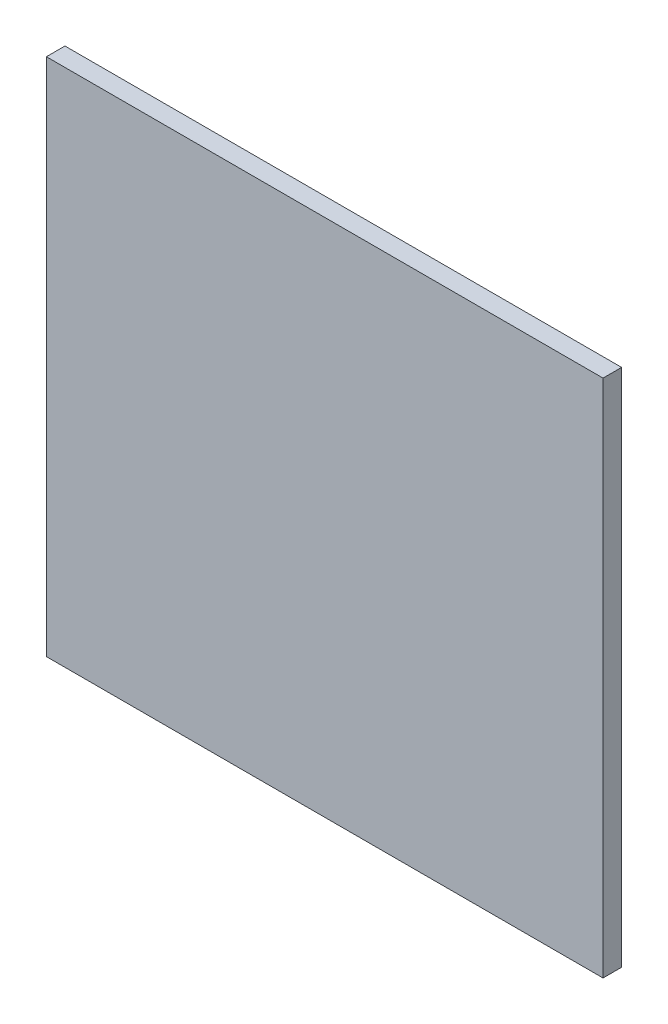
ISO-10303-21;
HEADER;
FILE_DESCRIPTION(('STEP AP214'),'2;1');
FILE_NAME('part.step','',(''),(''),'','','');
FILE_SCHEMA(('AUTOMOTIVE_DESIGN { 1 0 10303 214 1 1 1 1 }'));
ENDSEC;
DATA;
#1=APPLICATION_CONTEXT('core data for automotive mechanical design processes');
#2=APPLICATION_PROTOCOL_DEFINITION('international standard','automotive_design',2000,#1);
#3=PRODUCT_CONTEXT('',#1,'mechanical');
#4=PRODUCT('Part','Part','',(#3));
#5=PRODUCT_RELATED_PRODUCT_CATEGORY('part','',(#4));
#6=PRODUCT_DEFINITION_FORMATION('','',#4);
#7=PRODUCT_DEFINITION_CONTEXT('part definition',#1,'design');
#8=PRODUCT_DEFINITION('design','',#6,#7);
#9=PRODUCT_DEFINITION_SHAPE('','',#8);
#10=(LENGTH_UNIT() NAMED_UNIT(*) SI_UNIT(.MILLI.,.METRE.));
#11=(NAMED_UNIT(*) PLANE_ANGLE_UNIT() SI_UNIT($,.RADIAN.));
#12=(NAMED_UNIT(*) SI_UNIT($,.STERADIAN.) SOLID_ANGLE_UNIT());
#13=UNCERTAINTY_MEASURE_WITH_UNIT(LENGTH_MEASURE(1.E-05),#10,'distance_accuracy_value','');
#14=(GEOMETRIC_REPRESENTATION_CONTEXT(3) GLOBAL_UNCERTAINTY_ASSIGNED_CONTEXT((#13)) GLOBAL_UNIT_ASSIGNED_CONTEXT((#10,
#11,#12)) REPRESENTATION_CONTEXT('',''));
#15=CARTESIAN_POINT('',(0.,0.,0.));
#16=DIRECTION('',(0.,0.,1.));
#17=DIRECTION('',(1.,0.,0.));
#18=AXIS2_PLACEMENT_3D('',#15,#16,#17);
#19=CARTESIAN_POINT('',(0.,0.,1.));
#20=DIRECTION('',(1.,0.,0.));
#21=DIRECTION('',(0.,0.,-1.));
#22=AXIS2_PLACEMENT_3D('',#19,#20,#21);
#23=PLANE('',#22);
#24=DIRECTION('',(0.,-1.,0.));
#25=VECTOR('',#24,1.);
#26=CARTESIAN_POINT('',(0.,0.,0.));
#27=LINE('',#26,#25);
#28=CARTESIAN_POINT('',(0.,28.,0.));
#29=VERTEX_POINT('',#28);
#30=CARTESIAN_POINT('',(0.,0.,0.));
#31=VERTEX_POINT('',#30);
#32=EDGE_CURVE('E98',#29,#31,#27,.T.);
#33=ORIENTED_EDGE('',*,*,#32,.T.);
#34=DIRECTION('',(0.,0.,-1.));
#35=VECTOR('',#34,1.);
#36=CARTESIAN_POINT('',(0.,0.,1.));
#37=LINE('',#36,#35);
#38=CARTESIAN_POINT('',(0.,0.,1.));
#39=VERTEX_POINT('',#38);
#40=EDGE_CURVE('E11',#39,#31,#37,.T.);
#41=ORIENTED_EDGE('',*,*,#40,.F.);
#42=DIRECTION('',(0.,-1.,0.));
#43=VECTOR('',#42,1.);
#44=CARTESIAN_POINT('',(0.,0.,1.));
#45=LINE('',#44,#43);
#46=CARTESIAN_POINT('',(0.,28.,1.));
#47=VERTEX_POINT('',#46);
#48=EDGE_CURVE('E86',#47,#39,#45,.T.);
#49=ORIENTED_EDGE('',*,*,#48,.F.);
#50=DIRECTION('',(0.,0.,-1.));
#51=VECTOR('',#50,1.);
#52=CARTESIAN_POINT('',(0.,28.,1.));
#53=LINE('',#52,#51);
#54=EDGE_CURVE('E94',#47,#29,#53,.T.);
#55=ORIENTED_EDGE('',*,*,#54,.T.);
#56=EDGE_LOOP('',(#33,#41,#49,#55));
#57=FACE_BOUND('',#56,.T.);
#58=ADVANCED_FACE('F35',(#57),#23,.F.);
#59=CARTESIAN_POINT('',(0.,0.,1.));
#60=DIRECTION('',(0.,1.,0.));
#61=DIRECTION('',(0.,0.,1.));
#62=AXIS2_PLACEMENT_3D('',#59,#60,#61);
#63=PLANE('',#62);
#64=DIRECTION('',(1.,0.,0.));
#65=VECTOR('',#64,1.);
#66=CARTESIAN_POINT('',(0.,0.,0.));
#67=LINE('',#66,#65);
#68=CARTESIAN_POINT('',(30.,0.,0.));
#69=VERTEX_POINT('',#68);
#70=EDGE_CURVE('E90',#31,#69,#67,.T.);
#71=ORIENTED_EDGE('',*,*,#70,.T.);
#72=DIRECTION('',(0.,0.,-1.));
#73=VECTOR('',#72,1.);
#74=CARTESIAN_POINT('',(30.,0.,1.));
#75=LINE('',#74,#73);
#76=CARTESIAN_POINT('',(30.,0.,1.));
#77=VERTEX_POINT('',#76);
#78=EDGE_CURVE('E43',#77,#69,#75,.T.);
#79=ORIENTED_EDGE('',*,*,#78,.F.);
#80=DIRECTION('',(1.,0.,0.));
#81=VECTOR('',#80,1.);
#82=CARTESIAN_POINT('',(0.,0.,1.));
#83=LINE('',#82,#81);
#84=EDGE_CURVE('E81',#39,#77,#83,.T.);
#85=ORIENTED_EDGE('',*,*,#84,.F.);
#86=ORIENTED_EDGE('',*,*,#40,.T.);
#87=EDGE_LOOP('',(#71,#79,#85,#86));
#88=FACE_BOUND('',#87,.T.);
#89=ADVANCED_FACE('F89',(#88),#63,.F.);
#90=CARTESIAN_POINT('',(30.,0.,1.));
#91=DIRECTION('',(-1.,0.,0.));
#92=DIRECTION('',(0.,0.,1.));
#93=AXIS2_PLACEMENT_3D('',#90,#91,#92);
#94=PLANE('',#93);
#95=DIRECTION('',(0.,1.,0.));
#96=VECTOR('',#95,1.);
#97=CARTESIAN_POINT('',(30.,0.,0.));
#98=LINE('',#97,#96);
#99=CARTESIAN_POINT('',(30.,28.,0.));
#100=VERTEX_POINT('',#99);
#101=EDGE_CURVE('E68',#69,#100,#98,.T.);
#102=ORIENTED_EDGE('',*,*,#101,.T.);
#103=DIRECTION('',(0.,0.,-1.));
#104=VECTOR('',#103,1.);
#105=CARTESIAN_POINT('',(30.,28.,1.));
#106=LINE('',#105,#104);
#107=CARTESIAN_POINT('',(30.,28.,1.));
#108=VERTEX_POINT('',#107);
#109=EDGE_CURVE('E91',#108,#100,#106,.T.);
#110=ORIENTED_EDGE('',*,*,#109,.F.);
#111=DIRECTION('',(0.,1.,0.));
#112=VECTOR('',#111,1.);
#113=CARTESIAN_POINT('',(30.,0.,1.));
#114=LINE('',#113,#112);
#115=EDGE_CURVE('E84',#77,#108,#114,.T.);
#116=ORIENTED_EDGE('',*,*,#115,.F.);
#117=ORIENTED_EDGE('',*,*,#78,.T.);
#118=EDGE_LOOP('',(#102,#110,#116,#117));
#119=FACE_BOUND('',#118,.T.);
#120=ADVANCED_FACE('F92',(#119),#94,.F.);
#121=CARTESIAN_POINT('',(0.,28.,1.));
#122=DIRECTION('',(0.,-1.,0.));
#123=DIRECTION('',(0.,0.,-1.));
#124=AXIS2_PLACEMENT_3D('',#121,#122,#123);
#125=PLANE('',#124);
#126=DIRECTION('',(-1.,0.,0.));
#127=VECTOR('',#126,1.);
#128=CARTESIAN_POINT('',(0.,28.,0.));
#129=LINE('',#128,#127);
#130=EDGE_CURVE('E74',#100,#29,#129,.T.);
#131=ORIENTED_EDGE('',*,*,#130,.T.);
#132=ORIENTED_EDGE('',*,*,#54,.F.);
#133=DIRECTION('',(-1.,0.,0.));
#134=VECTOR('',#133,1.);
#135=CARTESIAN_POINT('',(0.,28.,1.));
#136=LINE('',#135,#134);
#137=EDGE_CURVE('E51',#108,#47,#136,.T.);
#138=ORIENTED_EDGE('',*,*,#137,.F.);
#139=ORIENTED_EDGE('',*,*,#109,.T.);
#140=EDGE_LOOP('',(#131,#132,#138,#139));
#141=FACE_BOUND('',#140,.T.);
#142=ADVANCED_FACE('F105',(#141),#125,.F.);
#143=CARTESIAN_POINT('',(0.,0.,1.));
#144=DIRECTION('',(0.,0.,-1.));
#145=DIRECTION('',(-1.,0.,0.));
#146=AXIS2_PLACEMENT_3D('',#143,#144,#145);
#147=PLANE('',#146);
#148=ORIENTED_EDGE('',*,*,#48,.T.);
#149=ORIENTED_EDGE('',*,*,#84,.T.);
#150=ORIENTED_EDGE('',*,*,#115,.T.);
#151=ORIENTED_EDGE('',*,*,#137,.T.);
#152=EDGE_LOOP('',(#148,#149,#150,#151));
#153=FACE_BOUND('',#152,.T.);
#154=ADVANCED_FACE('F82',(#153),#147,.F.);
#155=CARTESIAN_POINT('',(0.,0.,0.));
#156=DIRECTION('',(0.,0.,-1.));
#157=DIRECTION('',(-1.,0.,0.));
#158=AXIS2_PLACEMENT_3D('',#155,#156,#157);
#159=PLANE('',#158);
#160=ORIENTED_EDGE('',*,*,#32,.F.);
#161=ORIENTED_EDGE('',*,*,#130,.F.);
#162=ORIENTED_EDGE('',*,*,#101,.F.);
#163=ORIENTED_EDGE('',*,*,#70,.F.);
#164=EDGE_LOOP('',(#160,#161,#162,#163));
#165=FACE_BOUND('',#164,.T.);
#166=ADVANCED_FACE('F108',(#165),#159,.T.);
#167=CLOSED_SHELL('',(#58,#89,#120,#142,#154,#166));
#168=MANIFOLD_SOLID_BREP('B2',#167);
#169=ADVANCED_BREP_SHAPE_REPRESENTATION('',(#18,#168),#14);
#170=SHAPE_DEFINITION_REPRESENTATION(#9,#169);
ENDSEC;
END-ISO-10303-21;
